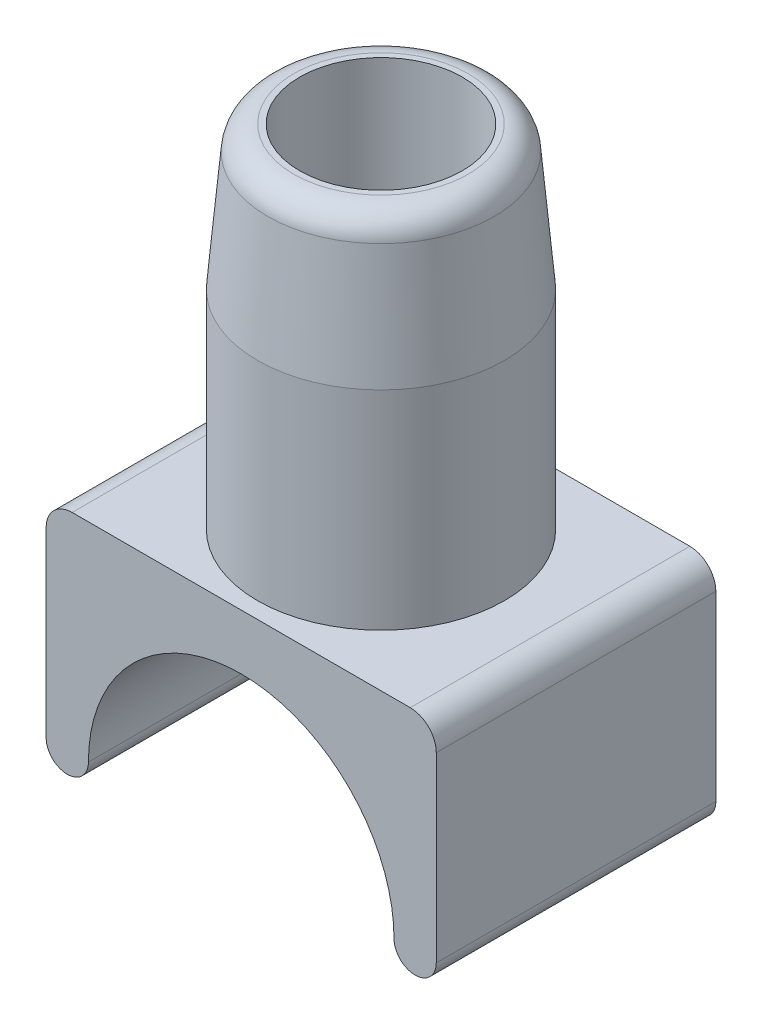
ISO-10303-21;
HEADER;
FILE_DESCRIPTION(('STEP AP214'),'2;1');
FILE_NAME('part.step','',(''),(''),'','','');
FILE_SCHEMA(('AUTOMOTIVE_DESIGN { 1 0 10303 214 1 1 1 1 }'));
ENDSEC;
DATA;
#1=APPLICATION_CONTEXT('core data for automotive mechanical design processes');
#2=APPLICATION_PROTOCOL_DEFINITION('international standard','automotive_design',2000,#1);
#3=PRODUCT_CONTEXT('',#1,'mechanical');
#4=PRODUCT('Part','Part','',(#3));
#5=PRODUCT_RELATED_PRODUCT_CATEGORY('part','',(#4));
#6=PRODUCT_DEFINITION_FORMATION('','',#4);
#7=PRODUCT_DEFINITION_CONTEXT('part definition',#1,'design');
#8=PRODUCT_DEFINITION('design','',#6,#7);
#9=PRODUCT_DEFINITION_SHAPE('','',#8);
#10=(LENGTH_UNIT() NAMED_UNIT(*) SI_UNIT(.MILLI.,.METRE.));
#11=(NAMED_UNIT(*) PLANE_ANGLE_UNIT() SI_UNIT($,.RADIAN.));
#12=(NAMED_UNIT(*) SI_UNIT($,.STERADIAN.) SOLID_ANGLE_UNIT());
#13=UNCERTAINTY_MEASURE_WITH_UNIT(LENGTH_MEASURE(1.E-05),#10,'distance_accuracy_value','');
#14=(GEOMETRIC_REPRESENTATION_CONTEXT(3) GLOBAL_UNCERTAINTY_ASSIGNED_CONTEXT((#13)) GLOBAL_UNIT_ASSIGNED_CONTEXT((#10,
#11,#12)) REPRESENTATION_CONTEXT('',''));
#15=CARTESIAN_POINT('',(0.,0.,0.));
#16=DIRECTION('',(0.,0.,1.));
#17=DIRECTION('',(1.,0.,0.));
#18=AXIS2_PLACEMENT_3D('',#15,#16,#17);
#19=CARTESIAN_POINT('',(-13.,0.,10.75));
#20=DIRECTION('',(0.,-1.,0.));
#21=DIRECTION('',(1.,0.,0.));
#22=AXIS2_PLACEMENT_3D('',#19,#20,#21);
#23=PLANE('',#22);
#24=DIRECTION('',(-1.,0.,0.));
#25=VECTOR('',#24,1.);
#26=CARTESIAN_POINT('',(-13.,0.,-10.75));
#27=LINE('',#26,#25);
#28=CARTESIAN_POINT('',(13.,0.,-10.75));
#29=VERTEX_POINT('',#28);
#30=CARTESIAN_POINT('',(-13.,0.,-10.75));
#31=VERTEX_POINT('',#30);
#32=EDGE_CURVE('E139',#29,#31,#27,.T.);
#33=ORIENTED_EDGE('',*,*,#32,.T.);
#34=DIRECTION('',(0.,0.,-1.));
#35=VECTOR('',#34,1.);
#36=CARTESIAN_POINT('',(-13.,0.,10.75));
#37=LINE('',#36,#35);
#38=CARTESIAN_POINT('',(-13.,0.,10.75));
#39=VERTEX_POINT('',#38);
#40=EDGE_CURVE('E150',#39,#31,#37,.T.);
#41=ORIENTED_EDGE('',*,*,#40,.F.);
#42=DIRECTION('',(-1.,0.,0.));
#43=VECTOR('',#42,1.);
#44=CARTESIAN_POINT('',(-13.,0.,10.75));
#45=LINE('',#44,#43);
#46=CARTESIAN_POINT('',(13.,0.,10.75));
#47=VERTEX_POINT('',#46);
#48=EDGE_CURVE('E209',#47,#39,#45,.T.);
#49=ORIENTED_EDGE('',*,*,#48,.F.);
#50=DIRECTION('',(0.,0.,-1.));
#51=VECTOR('',#50,1.);
#52=CARTESIAN_POINT('',(13.,0.,10.75));
#53=LINE('',#52,#51);
#54=EDGE_CURVE('E153',#47,#29,#53,.T.);
#55=ORIENTED_EDGE('',*,*,#54,.T.);
#56=EDGE_LOOP('',(#33,#41,#49,#55));
#57=FACE_BOUND('',#56,.T.);
#58=CARTESIAN_POINT('',(0.,0.,0.));
#59=DIRECTION('',(0.,1.,0.));
#60=DIRECTION('',(0.,0.,1.));
#61=AXIS2_PLACEMENT_3D('',#58,#59,#60);
#62=CIRCLE('',#61,9.5);
#63=CARTESIAN_POINT('',(0.,0.,9.5));
#64=VERTEX_POINT('',#63);
#65=EDGE_CURVE('E135',#64,#64,#62,.T.);
#66=ORIENTED_EDGE('',*,*,#65,.F.);
#67=EDGE_LOOP('',(#66));
#68=FACE_BOUND('',#67,.T.);
#69=ADVANCED_FACE('F33',(#57,#68),#23,.F.);
#70=CARTESIAN_POINT('',(13.375,-16.,10.75));
#71=DIRECTION('',(0.,0.,-1.));
#72=DIRECTION('',(-1.,0.,0.));
#73=AXIS2_PLACEMENT_3D('',#70,#71,#72);
#74=CYLINDRICAL_SURFACE('',#73,1.625);
#75=CARTESIAN_POINT('',(13.375,-16.,-10.75));
#76=DIRECTION('',(0.,0.,1.));
#77=DIRECTION('',(1.,0.,0.));
#78=AXIS2_PLACEMENT_3D('',#75,#76,#77);
#79=CIRCLE('',#78,1.625);
#80=CARTESIAN_POINT('',(11.75,-16.,-10.75));
#81=VERTEX_POINT('',#80);
#82=CARTESIAN_POINT('',(15.,-16.,-10.75));
#83=VERTEX_POINT('',#82);
#84=EDGE_CURVE('E131',#81,#83,#79,.T.);
#85=ORIENTED_EDGE('',*,*,#84,.T.);
#86=DIRECTION('',(0.,0.,-1.));
#87=VECTOR('',#86,1.);
#88=CARTESIAN_POINT('',(15.,-16.,10.75));
#89=LINE('',#88,#87);
#90=CARTESIAN_POINT('',(15.,-16.,10.75));
#91=VERTEX_POINT('',#90);
#92=EDGE_CURVE('E159',#91,#83,#89,.T.);
#93=ORIENTED_EDGE('',*,*,#92,.F.);
#94=CARTESIAN_POINT('',(13.375,-16.,10.75));
#95=DIRECTION('',(0.,0.,1.));
#96=DIRECTION('',(1.,0.,0.));
#97=AXIS2_PLACEMENT_3D('',#94,#95,#96);
#98=CIRCLE('',#97,1.625);
#99=CARTESIAN_POINT('',(11.75,-16.,10.75));
#100=VERTEX_POINT('',#99);
#101=EDGE_CURVE('E146',#100,#91,#98,.T.);
#102=ORIENTED_EDGE('',*,*,#101,.F.);
#103=DIRECTION('',(0.,0.,-1.));
#104=VECTOR('',#103,1.);
#105=CARTESIAN_POINT('',(11.75,-16.,10.75));
#106=LINE('',#105,#104);
#107=EDGE_CURVE('E127',#100,#81,#106,.T.);
#108=ORIENTED_EDGE('',*,*,#107,.T.);
#109=EDGE_LOOP('',(#85,#93,#102,#108));
#110=FACE_BOUND('',#109,.T.);
#111=ADVANCED_FACE('F177',(#110),#74,.T.);
#112=CARTESIAN_POINT('',(15.,-2.00000000000001,10.75));
#113=DIRECTION('',(-1.,0.,0.));
#114=DIRECTION('',(0.,-1.,0.));
#115=AXIS2_PLACEMENT_3D('',#112,#113,#114);
#116=PLANE('',#115);
#117=DIRECTION('',(0.,1.,0.));
#118=VECTOR('',#117,1.);
#119=CARTESIAN_POINT('',(15.,-2.00000000000001,-10.75));
#120=LINE('',#119,#118);
#121=CARTESIAN_POINT('',(15.,-2.00000000000001,-10.75));
#122=VERTEX_POINT('',#121);
#123=EDGE_CURVE('E134',#83,#122,#120,.T.);
#124=ORIENTED_EDGE('',*,*,#123,.T.);
#125=DIRECTION('',(0.,0.,-1.));
#126=VECTOR('',#125,1.);
#127=CARTESIAN_POINT('',(15.,-2.00000000000001,10.75));
#128=LINE('',#127,#126);
#129=CARTESIAN_POINT('',(15.,-2.00000000000001,10.75));
#130=VERTEX_POINT('',#129);
#131=EDGE_CURVE('E156',#130,#122,#128,.T.);
#132=ORIENTED_EDGE('',*,*,#131,.F.);
#133=DIRECTION('',(0.,1.,0.));
#134=VECTOR('',#133,1.);
#135=CARTESIAN_POINT('',(15.,-2.00000000000001,10.75));
#136=LINE('',#135,#134);
#137=EDGE_CURVE('E94',#91,#130,#136,.T.);
#138=ORIENTED_EDGE('',*,*,#137,.F.);
#139=ORIENTED_EDGE('',*,*,#92,.T.);
#140=EDGE_LOOP('',(#124,#132,#138,#139));
#141=FACE_BOUND('',#140,.T.);
#142=ADVANCED_FACE('F182',(#141),#116,.F.);
#143=CARTESIAN_POINT('',(13.,-1.99999999999999,10.75));
#144=DIRECTION('',(0.,0.,-1.));
#145=DIRECTION('',(-1.,0.,0.));
#146=AXIS2_PLACEMENT_3D('',#143,#144,#145);
#147=CYLINDRICAL_SURFACE('',#146,2.);
#148=CARTESIAN_POINT('',(13.,-1.99999999999999,-10.75));
#149=DIRECTION('',(0.,0.,1.));
#150=DIRECTION('',(1.,0.,0.));
#151=AXIS2_PLACEMENT_3D('',#148,#149,#150);
#152=CIRCLE('',#151,2.);
#153=EDGE_CURVE('E137',#122,#29,#152,.T.);
#154=ORIENTED_EDGE('',*,*,#153,.T.);
#155=ORIENTED_EDGE('',*,*,#54,.F.);
#156=CARTESIAN_POINT('',(13.,-1.99999999999999,10.75));
#157=DIRECTION('',(0.,0.,1.));
#158=DIRECTION('',(1.,0.,0.));
#159=AXIS2_PLACEMENT_3D('',#156,#157,#158);
#160=CIRCLE('',#159,2.);
#161=EDGE_CURVE('E202',#130,#47,#160,.T.);
#162=ORIENTED_EDGE('',*,*,#161,.F.);
#163=ORIENTED_EDGE('',*,*,#131,.T.);
#164=EDGE_LOOP('',(#154,#155,#162,#163));
#165=FACE_BOUND('',#164,.T.);
#166=ADVANCED_FACE('F189',(#165),#147,.T.);
#167=CARTESIAN_POINT('',(-13.,-2.,10.75));
#168=DIRECTION('',(0.,0.,-1.));
#169=DIRECTION('',(-1.,0.,0.));
#170=AXIS2_PLACEMENT_3D('',#167,#168,#169);
#171=CYLINDRICAL_SURFACE('',#170,2.);
#172=CARTESIAN_POINT('',(-13.,-2.,-10.75));
#173=DIRECTION('',(0.,0.,1.));
#174=DIRECTION('',(-1.,0.,0.));
#175=AXIS2_PLACEMENT_3D('',#172,#173,#174);
#176=CIRCLE('',#175,2.);
#177=CARTESIAN_POINT('',(-15.,-2.00000000000001,-10.75));
#178=VERTEX_POINT('',#177);
#179=EDGE_CURVE('E141',#31,#178,#176,.T.);
#180=ORIENTED_EDGE('',*,*,#179,.T.);
#181=DIRECTION('',(0.,0.,-1.));
#182=VECTOR('',#181,1.);
#183=CARTESIAN_POINT('',(-15.,-2.00000000000001,10.75));
#184=LINE('',#183,#182);
#185=CARTESIAN_POINT('',(-15.,-2.00000000000001,10.75));
#186=VERTEX_POINT('',#185);
#187=EDGE_CURVE('E122',#186,#178,#184,.T.);
#188=ORIENTED_EDGE('',*,*,#187,.F.);
#189=CARTESIAN_POINT('',(-13.,-2.,10.75));
#190=DIRECTION('',(0.,0.,1.));
#191=DIRECTION('',(-1.,0.,0.));
#192=AXIS2_PLACEMENT_3D('',#189,#190,#191);
#193=CIRCLE('',#192,2.);
#194=EDGE_CURVE('E113',#39,#186,#193,.T.);
#195=ORIENTED_EDGE('',*,*,#194,.F.);
#196=ORIENTED_EDGE('',*,*,#40,.T.);
#197=EDGE_LOOP('',(#180,#188,#195,#196));
#198=FACE_BOUND('',#197,.T.);
#199=ADVANCED_FACE('F187',(#198),#171,.T.);
#200=CARTESIAN_POINT('',(-15.,-16.,10.75));
#201=DIRECTION('',(1.,0.,0.));
#202=DIRECTION('',(0.,1.,0.));
#203=AXIS2_PLACEMENT_3D('',#200,#201,#202);
#204=PLANE('',#203);
#205=DIRECTION('',(0.,-1.,0.));
#206=VECTOR('',#205,1.);
#207=CARTESIAN_POINT('',(-15.,-16.,-10.75));
#208=LINE('',#207,#206);
#209=CARTESIAN_POINT('',(-15.,-16.,-10.75));
#210=VERTEX_POINT('',#209);
#211=EDGE_CURVE('E121',#178,#210,#208,.T.);
#212=ORIENTED_EDGE('',*,*,#211,.T.);
#213=DIRECTION('',(0.,0.,-1.));
#214=VECTOR('',#213,1.);
#215=CARTESIAN_POINT('',(-15.,-16.,10.75));
#216=LINE('',#215,#214);
#217=CARTESIAN_POINT('',(-15.,-16.,10.75));
#218=VERTEX_POINT('',#217);
#219=EDGE_CURVE('E118',#218,#210,#216,.T.);
#220=ORIENTED_EDGE('',*,*,#219,.F.);
#221=DIRECTION('',(0.,-1.,0.));
#222=VECTOR('',#221,1.);
#223=CARTESIAN_POINT('',(-15.,-16.,10.75));
#224=LINE('',#223,#222);
#225=EDGE_CURVE('E107',#186,#218,#224,.T.);
#226=ORIENTED_EDGE('',*,*,#225,.F.);
#227=ORIENTED_EDGE('',*,*,#187,.T.);
#228=EDGE_LOOP('',(#212,#220,#226,#227));
#229=FACE_BOUND('',#228,.T.);
#230=ADVANCED_FACE('F119',(#229),#204,.F.);
#231=CARTESIAN_POINT('',(-13.375,-16.,10.75));
#232=DIRECTION('',(0.,0.,-1.));
#233=DIRECTION('',(-1.,0.,0.));
#234=AXIS2_PLACEMENT_3D('',#231,#232,#233);
#235=CYLINDRICAL_SURFACE('',#234,1.625);
#236=CARTESIAN_POINT('',(-13.375,-16.,-10.75));
#237=DIRECTION('',(0.,0.,1.));
#238=DIRECTION('',(1.,0.,0.));
#239=AXIS2_PLACEMENT_3D('',#236,#237,#238);
#240=CIRCLE('',#239,1.625);
#241=CARTESIAN_POINT('',(-11.75,-16.,-10.75));
#242=VERTEX_POINT('',#241);
#243=EDGE_CURVE('E79',#210,#242,#240,.T.);
#244=ORIENTED_EDGE('',*,*,#243,.T.);
#245=DIRECTION('',(0.,0.,-1.));
#246=VECTOR('',#245,1.);
#247=CARTESIAN_POINT('',(-11.75,-16.,10.75));
#248=LINE('',#247,#246);
#249=CARTESIAN_POINT('',(-11.75,-16.,10.75));
#250=VERTEX_POINT('',#249);
#251=EDGE_CURVE('E123',#250,#242,#248,.T.);
#252=ORIENTED_EDGE('',*,*,#251,.F.);
#253=CARTESIAN_POINT('',(-13.375,-16.,10.75));
#254=DIRECTION('',(0.,0.,1.));
#255=DIRECTION('',(1.,0.,0.));
#256=AXIS2_PLACEMENT_3D('',#253,#254,#255);
#257=CIRCLE('',#256,1.625);
#258=EDGE_CURVE('E111',#218,#250,#257,.T.);
#259=ORIENTED_EDGE('',*,*,#258,.F.);
#260=ORIENTED_EDGE('',*,*,#219,.T.);
#261=EDGE_LOOP('',(#244,#252,#259,#260));
#262=FACE_BOUND('',#261,.T.);
#263=ADVANCED_FACE('F125',(#262),#235,.T.);
#264=CARTESIAN_POINT('',(0.,-16.,10.75));
#265=DIRECTION('',(0.,0.,-1.));
#266=DIRECTION('',(-1.,0.,0.));
#267=AXIS2_PLACEMENT_3D('',#264,#265,#266);
#268=CYLINDRICAL_SURFACE('',#267,11.75);
#269=CARTESIAN_POINT('',(0.,-16.,-10.75));
#270=DIRECTION('',(0.,0.,-1.));
#271=DIRECTION('',(1.,0.,0.));
#272=AXIS2_PLACEMENT_3D('',#269,#270,#271);
#273=CIRCLE('',#272,11.75);
#274=EDGE_CURVE('E85',#242,#81,#273,.T.);
#275=ORIENTED_EDGE('',*,*,#274,.T.);
#276=ORIENTED_EDGE('',*,*,#107,.F.);
#277=CARTESIAN_POINT('',(0.,-16.,10.75));
#278=DIRECTION('',(0.,0.,-1.));
#279=DIRECTION('',(1.,0.,0.));
#280=AXIS2_PLACEMENT_3D('',#277,#278,#279);
#281=CIRCLE('',#280,11.75);
#282=EDGE_CURVE('E50',#250,#100,#281,.T.);
#283=ORIENTED_EDGE('',*,*,#282,.F.);
#284=ORIENTED_EDGE('',*,*,#251,.T.);
#285=EDGE_LOOP('',(#275,#276,#283,#284));
#286=FACE_BOUND('',#285,.T.);
#287=ADVANCED_FACE('F245',(#286),#268,.F.);
#288=CARTESIAN_POINT('',(13.375,-16.,10.75));
#289=DIRECTION('',(0.,0.,1.));
#290=DIRECTION('',(1.,0.,0.));
#291=AXIS2_PLACEMENT_3D('',#288,#289,#290);
#292=PLANE('',#291);
#293=ORIENTED_EDGE('',*,*,#101,.T.);
#294=ORIENTED_EDGE('',*,*,#137,.T.);
#295=ORIENTED_EDGE('',*,*,#161,.T.);
#296=ORIENTED_EDGE('',*,*,#48,.T.);
#297=ORIENTED_EDGE('',*,*,#194,.T.);
#298=ORIENTED_EDGE('',*,*,#225,.T.);
#299=ORIENTED_EDGE('',*,*,#258,.T.);
#300=ORIENTED_EDGE('',*,*,#282,.T.);
#301=EDGE_LOOP('',(#293,#294,#295,#296,#297,#298,#299,#300));
#302=FACE_BOUND('',#301,.T.);
#303=ADVANCED_FACE('F109',(#302),#292,.T.);
#304=CARTESIAN_POINT('',(13.375,-16.,-10.75));
#305=DIRECTION('',(0.,0.,1.));
#306=DIRECTION('',(1.,0.,0.));
#307=AXIS2_PLACEMENT_3D('',#304,#305,#306);
#308=PLANE('',#307);
#309=ORIENTED_EDGE('',*,*,#84,.F.);
#310=ORIENTED_EDGE('',*,*,#274,.F.);
#311=ORIENTED_EDGE('',*,*,#243,.F.);
#312=ORIENTED_EDGE('',*,*,#211,.F.);
#313=ORIENTED_EDGE('',*,*,#179,.F.);
#314=ORIENTED_EDGE('',*,*,#32,.F.);
#315=ORIENTED_EDGE('',*,*,#153,.F.);
#316=ORIENTED_EDGE('',*,*,#123,.F.);
#317=EDGE_LOOP('',(#309,#310,#311,#312,#313,#314,#315,#316));
#318=FACE_BOUND('',#317,.T.);
#319=ADVANCED_FACE('F204',(#318),#308,.F.);
#320=CARTESIAN_POINT('',(0.,13.1861298276487,0.));
#321=DIRECTION('',(0.,1.,0.));
#322=DIRECTION('',(0.,0.,1.));
#323=AXIS2_PLACEMENT_3D('',#320,#321,#322);
#324=CYLINDRICAL_SURFACE('',#323,9.5);
#325=ORIENTED_EDGE('',*,*,#65,.T.);
#326=EDGE_LOOP('',(#325));
#327=FACE_BOUND('',#326,.T.);
#328=CARTESIAN_POINT('',(0.,16.,0.));
#329=DIRECTION('',(0.,1.,0.));
#330=DIRECTION('',(0.,0.,1.));
#331=AXIS2_PLACEMENT_3D('',#328,#329,#330);
#332=CIRCLE('',#331,9.5);
#333=CARTESIAN_POINT('',(0.,16.,9.5));
#334=VERTEX_POINT('',#333);
#335=EDGE_CURVE('E217',#334,#334,#332,.T.);
#336=ORIENTED_EDGE('',*,*,#335,.F.);
#337=EDGE_LOOP('',(#336));
#338=FACE_BOUND('',#337,.T.);
#339=ADVANCED_FACE('F238',(#327,#338),#324,.T.);
#340=CARTESIAN_POINT('',(0.,27.,0.));
#341=DIRECTION('',(0.,-1.,0.));
#342=DIRECTION('',(0.,0.,-1.));
#343=AXIS2_PLACEMENT_3D('',#340,#341,#342);
#344=CONICAL_SURFACE('',#343,8.53762470121488,0.0872664625997127);
#345=CARTESIAN_POINT('',(0.,25.1743114854953,0.));
#346=DIRECTION('',(0.,1.,0.));
#347=DIRECTION('',(0.,0.,1.));
#348=AXIS2_PLACEMENT_3D('',#345,#346,#347);
#349=CIRCLE('',#348,8.69735174936352);
#350=CARTESIAN_POINT('',(0.,25.1743114854953,8.69735174936352));
#351=VERTEX_POINT('',#350);
#352=EDGE_CURVE('E11',#351,#351,#349,.F.);
#353=ORIENTED_EDGE('',*,*,#352,.T.);
#354=EDGE_LOOP('',(#353));
#355=FACE_BOUND('',#354,.T.);
#356=ORIENTED_EDGE('',*,*,#335,.T.);
#357=EDGE_LOOP('',(#356));
#358=FACE_BOUND('',#357,.T.);
#359=ADVANCED_FACE('F233',(#355,#358),#344,.T.);
#360=CARTESIAN_POINT('',(-8.53762470121488,27.,0.));
#361=DIRECTION('',(0.,1.,0.));
#362=DIRECTION('',(0.,0.,1.));
#363=AXIS2_PLACEMENT_3D('',#360,#361,#362);
#364=PLANE('',#363);
#365=CARTESIAN_POINT('',(0.,27.,0.));
#366=DIRECTION('',(0.,1.,0.));
#367=DIRECTION('',(0.,0.,1.));
#368=AXIS2_PLACEMENT_3D('',#365,#366,#367);
#369=CIRCLE('',#368,6.70496235318002);
#370=CARTESIAN_POINT('',(0.,27.,6.70496235318002));
#371=VERTEX_POINT('',#370);
#372=EDGE_CURVE('E42',#371,#371,#369,.T.);
#373=ORIENTED_EDGE('',*,*,#372,.T.);
#374=EDGE_LOOP('',(#373));
#375=FACE_BOUND('',#374,.T.);
#376=CARTESIAN_POINT('',(0.,27.,0.));
#377=DIRECTION('',(0.,1.,0.));
#378=DIRECTION('',(0.,0.,1.));
#379=AXIS2_PLACEMENT_3D('',#376,#377,#378);
#380=CIRCLE('',#379,6.25);
#381=CARTESIAN_POINT('',(0.,27.,6.25));
#382=VERTEX_POINT('',#381);
#383=EDGE_CURVE('E220',#382,#382,#380,.T.);
#384=ORIENTED_EDGE('',*,*,#383,.F.);
#385=EDGE_LOOP('',(#384));
#386=FACE_BOUND('',#385,.T.);
#387=ADVANCED_FACE('F163',(#375,#386),#364,.T.);
#388=CARTESIAN_POINT('',(0.,13.1861298276487,0.));
#389=DIRECTION('',(0.,1.,0.));
#390=DIRECTION('',(0.,0.,1.));
#391=AXIS2_PLACEMENT_3D('',#388,#389,#390);
#392=CYLINDRICAL_SURFACE('',#391,6.25);
#393=ORIENTED_EDGE('',*,*,#383,.T.);
#394=EDGE_LOOP('',(#393));
#395=FACE_BOUND('',#394,.T.);
#396=CARTESIAN_POINT('',(0.,0.,0.));
#397=DIRECTION('',(0.,1.,0.));
#398=DIRECTION('',(0.,0.,1.));
#399=AXIS2_PLACEMENT_3D('',#396,#397,#398);
#400=CIRCLE('',#399,6.25);
#401=CARTESIAN_POINT('',(0.,0.,6.25));
#402=VERTEX_POINT('',#401);
#403=EDGE_CURVE('E223',#402,#402,#400,.T.);
#404=ORIENTED_EDGE('',*,*,#403,.F.);
#405=EDGE_LOOP('',(#404));
#406=FACE_BOUND('',#405,.T.);
#407=ADVANCED_FACE('F172',(#395,#406),#392,.F.);
#408=ORIENTED_EDGE('',*,*,#403,.T.);
#409=EDGE_LOOP('',(#408));
#410=FACE_BOUND('',#409,.T.);
#411=ADVANCED_FACE('F167',(#410),#23,.F.);
#412=CARTESIAN_POINT('',(0.,25.,0.));
#413=DIRECTION('',(0.,1.,0.));
#414=DIRECTION('',(0.,0.,1.));
#415=AXIS2_PLACEMENT_3D('',#412,#413,#414);
#416=TOROIDAL_SURFACE('',#415,6.70496235318002,2.);
#417=ORIENTED_EDGE('',*,*,#352,.F.);
#418=EDGE_LOOP('',(#417));
#419=FACE_BOUND('',#418,.T.);
#420=ORIENTED_EDGE('',*,*,#372,.F.);
#421=EDGE_LOOP('',(#420));
#422=FACE_BOUND('',#421,.T.);
#423=ADVANCED_FACE('F35',(#419,#422),#416,.T.);
#424=CLOSED_SHELL('',(#69,#111,#142,#166,#199,#230,#263,#287,#303,#319,#339,#359,#387,#407,#411,#423));
#425=MANIFOLD_SOLID_BREP('B2',#424);
#426=ADVANCED_BREP_SHAPE_REPRESENTATION('',(#18,#425),#14);
#427=SHAPE_DEFINITION_REPRESENTATION(#9,#426);
ENDSEC;
END-ISO-10303-21;
